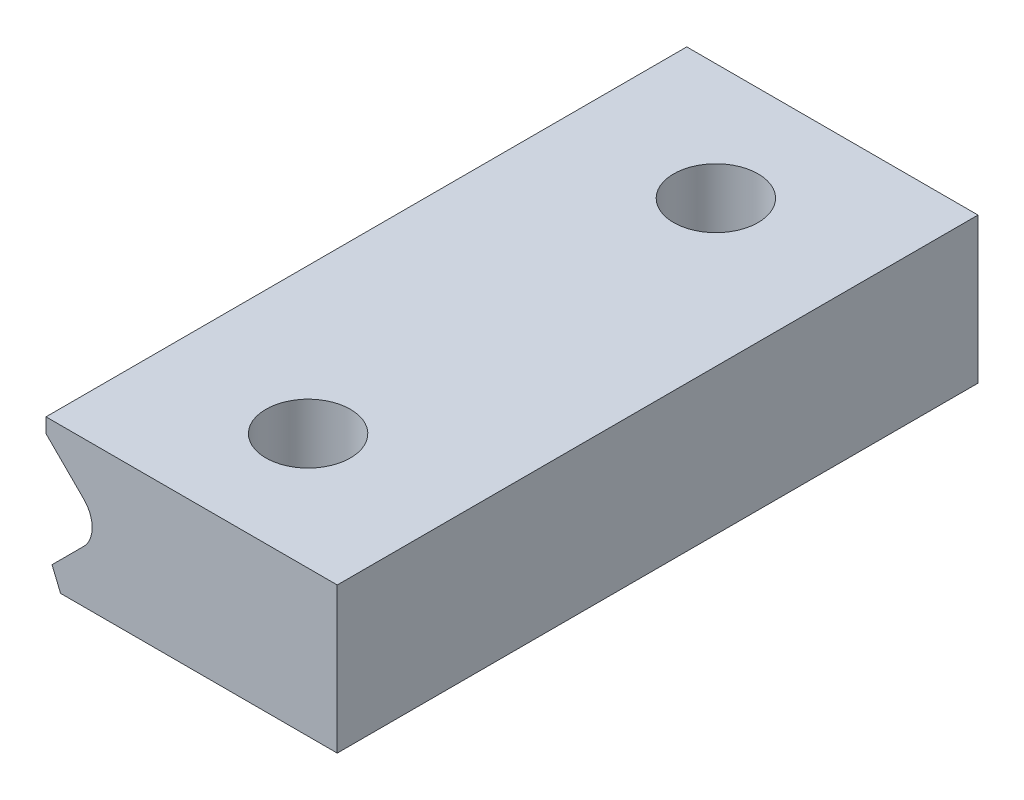
ISO-10303-21;
HEADER;
FILE_DESCRIPTION(('STEP AP214'),'2;1');
FILE_NAME('part.step','',(''),(''),'','','');
FILE_SCHEMA(('AUTOMOTIVE_DESIGN { 1 0 10303 214 1 1 1 1 }'));
ENDSEC;
DATA;
#1=APPLICATION_CONTEXT('core data for automotive mechanical design processes');
#2=APPLICATION_PROTOCOL_DEFINITION('international standard','automotive_design',2000,#1);
#3=PRODUCT_CONTEXT('',#1,'mechanical');
#4=PRODUCT('Part','Part','',(#3));
#5=PRODUCT_RELATED_PRODUCT_CATEGORY('part','',(#4));
#6=PRODUCT_DEFINITION_FORMATION('','',#4);
#7=PRODUCT_DEFINITION_CONTEXT('part definition',#1,'design');
#8=PRODUCT_DEFINITION('design','',#6,#7);
#9=PRODUCT_DEFINITION_SHAPE('','',#8);
#10=(LENGTH_UNIT() NAMED_UNIT(*) SI_UNIT(.MILLI.,.METRE.));
#11=(NAMED_UNIT(*) PLANE_ANGLE_UNIT() SI_UNIT($,.RADIAN.));
#12=(NAMED_UNIT(*) SI_UNIT($,.STERADIAN.) SOLID_ANGLE_UNIT());
#13=UNCERTAINTY_MEASURE_WITH_UNIT(LENGTH_MEASURE(1.E-05),#10,'distance_accuracy_value','');
#14=(GEOMETRIC_REPRESENTATION_CONTEXT(3) GLOBAL_UNCERTAINTY_ASSIGNED_CONTEXT((#13)) GLOBAL_UNIT_ASSIGNED_CONTEXT((#10,
#11,#12)) REPRESENTATION_CONTEXT('',''));
#15=CARTESIAN_POINT('',(0.,0.,0.));
#16=DIRECTION('',(0.,0.,1.));
#17=DIRECTION('',(1.,0.,0.));
#18=AXIS2_PLACEMENT_3D('',#15,#16,#17);
#19=CARTESIAN_POINT('',(-10.5,2.5,11.));
#20=DIRECTION('',(0.,-1.,0.));
#21=DIRECTION('',(1.,0.,0.));
#22=AXIS2_PLACEMENT_3D('',#19,#20,#21);
#23=PLANE('',#22);
#24=CARTESIAN_POINT('',(-5.,2.5,7.));
#25=DIRECTION('',(0.,-1.,0.));
#26=DIRECTION('',(0.,0.,-1.));
#27=AXIS2_PLACEMENT_3D('',#24,#25,#26);
#28=CIRCLE('',#27,1.45);
#29=CARTESIAN_POINT('',(-5.,2.5,5.55));
#30=VERTEX_POINT('',#29);
#31=EDGE_CURVE('E207',#30,#30,#28,.T.);
#32=ORIENTED_EDGE('',*,*,#31,.T.);
#33=EDGE_LOOP('',(#32));
#34=FACE_BOUND('',#33,.T.);
#35=CARTESIAN_POINT('',(-5.,2.5,-7.));
#36=DIRECTION('',(0.,-1.,0.));
#37=DIRECTION('',(0.,0.,-1.));
#38=AXIS2_PLACEMENT_3D('',#35,#36,#37);
#39=CIRCLE('',#38,1.45);
#40=CARTESIAN_POINT('',(-5.,2.5,-8.45));
#41=VERTEX_POINT('',#40);
#42=EDGE_CURVE('E194',#41,#41,#39,.T.);
#43=ORIENTED_EDGE('',*,*,#42,.T.);
#44=EDGE_LOOP('',(#43));
#45=FACE_BOUND('',#44,.T.);
#46=DIRECTION('',(-1.,0.,0.));
#47=VECTOR('',#46,1.);
#48=CARTESIAN_POINT('',(-10.5,2.5,-11.));
#49=LINE('',#48,#47);
#50=CARTESIAN_POINT('',(0.,2.5,-11.));
#51=VERTEX_POINT('',#50);
#52=CARTESIAN_POINT('',(-10.,2.5,-11.));
#53=VERTEX_POINT('',#52);
#54=EDGE_CURVE('E133',#51,#53,#49,.T.);
#55=ORIENTED_EDGE('',*,*,#54,.T.);
#56=DIRECTION('',(0.,0.,1.));
#57=VECTOR('',#56,1.);
#58=CARTESIAN_POINT('',(-10.,2.5,-11.));
#59=LINE('',#58,#57);
#60=CARTESIAN_POINT('',(-10.,2.5,11.));
#61=VERTEX_POINT('',#60);
#62=EDGE_CURVE('E59',#53,#61,#59,.T.);
#63=ORIENTED_EDGE('',*,*,#62,.T.);
#64=DIRECTION('',(-1.,0.,0.));
#65=VECTOR('',#64,1.);
#66=CARTESIAN_POINT('',(-10.5,2.5,11.));
#67=LINE('',#66,#65);
#68=CARTESIAN_POINT('',(0.,2.5,11.));
#69=VERTEX_POINT('',#68);
#70=EDGE_CURVE('E147',#69,#61,#67,.T.);
#71=ORIENTED_EDGE('',*,*,#70,.F.);
#72=DIRECTION('',(0.,0.,-1.));
#73=VECTOR('',#72,1.);
#74=CARTESIAN_POINT('',(0.,2.5,11.));
#75=LINE('',#74,#73);
#76=EDGE_CURVE('E148',#69,#51,#75,.T.);
#77=ORIENTED_EDGE('',*,*,#76,.T.);
#78=EDGE_LOOP('',(#55,#63,#71,#77));
#79=FACE_BOUND('',#78,.T.);
#80=ADVANCED_FACE('F42',(#34,#45,#79),#23,.F.);
#81=CARTESIAN_POINT('',(-10.5,2.5,11.));
#82=DIRECTION('',(0.707106781186549,0.707106781186546,0.));
#83=DIRECTION('',(-0.707106781186546,0.707106781186549,0.));
#84=AXIS2_PLACEMENT_3D('',#81,#82,#83);
#85=PLANE('',#84);
#86=DIRECTION('',(0.707106781186546,-0.707106781186549,0.));
#87=VECTOR('',#86,1.);
#88=CARTESIAN_POINT('',(-10.5,2.5,11.));
#89=LINE('',#88,#87);
#90=CARTESIAN_POINT('',(-10.,2.,11.));
#91=VERTEX_POINT('',#90);
#92=CARTESIAN_POINT('',(-8.70710678118655,0.707106781186547,11.));
#93=VERTEX_POINT('',#92);
#94=EDGE_CURVE('E124',#91,#93,#89,.T.);
#95=ORIENTED_EDGE('',*,*,#94,.F.);
#96=DIRECTION('',(0.,0.,1.));
#97=VECTOR('',#96,1.);
#98=CARTESIAN_POINT('',(-10.,2.,-11.));
#99=LINE('',#98,#97);
#100=CARTESIAN_POINT('',(-10.,2.,-11.));
#101=VERTEX_POINT('',#100);
#102=EDGE_CURVE('E109',#101,#91,#99,.T.);
#103=ORIENTED_EDGE('',*,*,#102,.F.);
#104=DIRECTION('',(0.707106781186546,-0.707106781186549,0.));
#105=VECTOR('',#104,1.);
#106=CARTESIAN_POINT('',(-10.5,2.5,-11.));
#107=LINE('',#106,#105);
#108=CARTESIAN_POINT('',(-8.70710678118655,0.707106781186547,-11.));
#109=VERTEX_POINT('',#108);
#110=EDGE_CURVE('E122',#101,#109,#107,.T.);
#111=ORIENTED_EDGE('',*,*,#110,.T.);
#112=DIRECTION('',(0.,0.,-1.));
#113=VECTOR('',#112,1.);
#114=CARTESIAN_POINT('',(-8.70710678118655,0.707106781186547,11.));
#115=LINE('',#114,#113);
#116=EDGE_CURVE('E161',#109,#93,#115,.F.);
#117=ORIENTED_EDGE('',*,*,#116,.T.);
#118=EDGE_LOOP('',(#95,#103,#111,#117));
#119=FACE_BOUND('',#118,.T.);
#120=ADVANCED_FACE('F120',(#119),#85,.F.);
#121=CARTESIAN_POINT('',(-10.5,-2.5,11.));
#122=DIRECTION('',(0.707106781186548,-0.707106781186547,0.));
#123=DIRECTION('',(0.707106781186547,0.707106781186548,0.));
#124=AXIS2_PLACEMENT_3D('',#121,#122,#123);
#125=PLANE('',#124);
#126=DIRECTION('',(-0.707106781186547,-0.707106781186548,0.));
#127=VECTOR('',#126,1.);
#128=CARTESIAN_POINT('',(-10.5,-2.5,-11.));
#129=LINE('',#128,#127);
#130=CARTESIAN_POINT('',(-8.70710678118655,-0.707106781186546,-11.));
#131=VERTEX_POINT('',#130);
#132=CARTESIAN_POINT('',(-9.79289321881345,-1.79289321881345,-11.));
#133=VERTEX_POINT('',#132);
#134=EDGE_CURVE('E132',#131,#133,#129,.T.);
#135=ORIENTED_EDGE('',*,*,#134,.T.);
#136=DIRECTION('',(0.,0.,1.));
#137=VECTOR('',#136,1.);
#138=CARTESIAN_POINT('',(-9.79289321881345,-1.79289321881345,11.));
#139=LINE('',#138,#137);
#140=CARTESIAN_POINT('',(-9.79289321881345,-1.79289321881345,11.));
#141=VERTEX_POINT('',#140);
#142=EDGE_CURVE('E52',#133,#141,#139,.T.);
#143=ORIENTED_EDGE('',*,*,#142,.T.);
#144=DIRECTION('',(-0.707106781186547,-0.707106781186548,0.));
#145=VECTOR('',#144,1.);
#146=CARTESIAN_POINT('',(-10.5,-2.5,11.));
#147=LINE('',#146,#145);
#148=CARTESIAN_POINT('',(-8.70710678118655,-0.707106781186546,11.));
#149=VERTEX_POINT('',#148);
#150=EDGE_CURVE('E180',#149,#141,#147,.T.);
#151=ORIENTED_EDGE('',*,*,#150,.F.);
#152=DIRECTION('',(0.,0.,-1.));
#153=VECTOR('',#152,1.);
#154=CARTESIAN_POINT('',(-8.70710678118655,-0.707106781186546,-11.));
#155=LINE('',#154,#153);
#156=EDGE_CURVE('E157',#149,#131,#155,.T.);
#157=ORIENTED_EDGE('',*,*,#156,.T.);
#158=EDGE_LOOP('',(#135,#143,#151,#157));
#159=FACE_BOUND('',#158,.T.);
#160=ADVANCED_FACE('F226',(#159),#125,.F.);
#161=CARTESIAN_POINT('',(-10.5,-2.5,11.));
#162=DIRECTION('',(0.,1.,0.));
#163=DIRECTION('',(-1.,0.,0.));
#164=AXIS2_PLACEMENT_3D('',#161,#162,#163);
#165=PLANE('',#164);
#166=CARTESIAN_POINT('',(-5.,-2.5,7.));
#167=DIRECTION('',(0.,-1.,0.));
#168=DIRECTION('',(0.,0.,-1.));
#169=AXIS2_PLACEMENT_3D('',#166,#167,#168);
#170=CIRCLE('',#169,2.7);
#171=CARTESIAN_POINT('',(-5.,-2.5,4.3));
#172=VERTEX_POINT('',#171);
#173=EDGE_CURVE('E215',#172,#172,#170,.T.);
#174=ORIENTED_EDGE('',*,*,#173,.F.);
#175=EDGE_LOOP('',(#174));
#176=FACE_BOUND('',#175,.T.);
#177=CARTESIAN_POINT('',(-5.,-2.5,-7.));
#178=DIRECTION('',(0.,-1.,0.));
#179=DIRECTION('',(0.,0.,-1.));
#180=AXIS2_PLACEMENT_3D('',#177,#178,#179);
#181=CIRCLE('',#180,2.7);
#182=CARTESIAN_POINT('',(-5.,-2.5,-9.7));
#183=VERTEX_POINT('',#182);
#184=EDGE_CURVE('E203',#183,#183,#181,.T.);
#185=ORIENTED_EDGE('',*,*,#184,.F.);
#186=EDGE_LOOP('',(#185));
#187=FACE_BOUND('',#186,.T.);
#188=DIRECTION('',(1.,0.,0.));
#189=VECTOR('',#188,1.);
#190=CARTESIAN_POINT('',(-10.5,-2.5,11.));
#191=LINE('',#190,#189);
#192=CARTESIAN_POINT('',(-9.5,-2.5,11.));
#193=VERTEX_POINT('',#192);
#194=CARTESIAN_POINT('',(0.,-2.5,11.));
#195=VERTEX_POINT('',#194);
#196=EDGE_CURVE('E178',#193,#195,#191,.T.);
#197=ORIENTED_EDGE('',*,*,#196,.F.);
#198=DIRECTION('',(0.,0.,-1.));
#199=VECTOR('',#198,1.);
#200=CARTESIAN_POINT('',(-9.5,-2.5,11.));
#201=LINE('',#200,#199);
#202=CARTESIAN_POINT('',(-9.5,-2.5,-11.));
#203=VERTEX_POINT('',#202);
#204=EDGE_CURVE('E169',#193,#203,#201,.T.);
#205=ORIENTED_EDGE('',*,*,#204,.T.);
#206=DIRECTION('',(1.,0.,0.));
#207=VECTOR('',#206,1.);
#208=CARTESIAN_POINT('',(-10.5,-2.5,-11.));
#209=LINE('',#208,#207);
#210=CARTESIAN_POINT('',(0.,-2.5,-11.));
#211=VERTEX_POINT('',#210);
#212=EDGE_CURVE('E137',#203,#211,#209,.T.);
#213=ORIENTED_EDGE('',*,*,#212,.T.);
#214=DIRECTION('',(0.,0.,-1.));
#215=VECTOR('',#214,1.);
#216=CARTESIAN_POINT('',(0.,-2.5,11.));
#217=LINE('',#216,#215);
#218=EDGE_CURVE('E152',#195,#211,#217,.T.);
#219=ORIENTED_EDGE('',*,*,#218,.F.);
#220=EDGE_LOOP('',(#197,#205,#213,#219));
#221=FACE_BOUND('',#220,.T.);
#222=ADVANCED_FACE('F222',(#176,#187,#221),#165,.F.);
#223=CARTESIAN_POINT('',(0.,2.5,11.));
#224=DIRECTION('',(-1.,0.,0.));
#225=DIRECTION('',(0.,0.,1.));
#226=AXIS2_PLACEMENT_3D('',#223,#224,#225);
#227=PLANE('',#226);
#228=DIRECTION('',(0.,1.,0.));
#229=VECTOR('',#228,1.);
#230=CARTESIAN_POINT('',(0.,2.5,-11.));
#231=LINE('',#230,#229);
#232=EDGE_CURVE('E144',#211,#51,#231,.T.);
#233=ORIENTED_EDGE('',*,*,#232,.T.);
#234=ORIENTED_EDGE('',*,*,#76,.F.);
#235=DIRECTION('',(0.,1.,0.));
#236=VECTOR('',#235,1.);
#237=CARTESIAN_POINT('',(0.,2.5,11.));
#238=LINE('',#237,#236);
#239=EDGE_CURVE('E153',#195,#69,#238,.T.);
#240=ORIENTED_EDGE('',*,*,#239,.F.);
#241=ORIENTED_EDGE('',*,*,#218,.T.);
#242=EDGE_LOOP('',(#233,#234,#240,#241));
#243=FACE_BOUND('',#242,.T.);
#244=ADVANCED_FACE('F225',(#243),#227,.F.);
#245=CARTESIAN_POINT('',(0.,0.,11.));
#246=DIRECTION('',(0.,0.,-1.));
#247=DIRECTION('',(-1.,0.,0.));
#248=AXIS2_PLACEMENT_3D('',#245,#246,#247);
#249=PLANE('',#248);
#250=ORIENTED_EDGE('',*,*,#70,.T.);
#251=DIRECTION('',(0.,1.,0.));
#252=VECTOR('',#251,1.);
#253=CARTESIAN_POINT('',(-9.99999999999999,0.,11.));
#254=LINE('',#253,#252);
#255=EDGE_CURVE('E116',#91,#61,#254,.T.);
#256=ORIENTED_EDGE('',*,*,#255,.F.);
#257=ORIENTED_EDGE('',*,*,#94,.T.);
#258=CARTESIAN_POINT('',(-9.4142135623731,0.,11.));
#259=DIRECTION('',(0.,0.,-1.));
#260=DIRECTION('',(-1.,0.,0.));
#261=AXIS2_PLACEMENT_3D('',#258,#259,#260);
#262=CIRCLE('',#261,1.);
#263=EDGE_CURVE('E166',#93,#149,#262,.T.);
#264=ORIENTED_EDGE('',*,*,#263,.T.);
#265=ORIENTED_EDGE('',*,*,#150,.T.);
#266=DIRECTION('',(-0.38268343236509,0.923879532511287,0.));
#267=VECTOR('',#266,1.);
#268=CARTESIAN_POINT('',(-9.5,-2.5,11.));
#269=LINE('',#268,#267);
#270=EDGE_CURVE('E11',#141,#193,#269,.F.);
#271=ORIENTED_EDGE('',*,*,#270,.T.);
#272=ORIENTED_EDGE('',*,*,#196,.T.);
#273=ORIENTED_EDGE('',*,*,#239,.T.);
#274=EDGE_LOOP('',(#250,#256,#257,#264,#265,#271,#272,#273));
#275=FACE_BOUND('',#274,.T.);
#276=ADVANCED_FACE('F242',(#275),#249,.F.);
#277=CARTESIAN_POINT('',(0.,0.,-11.));
#278=DIRECTION('',(0.,0.,-1.));
#279=DIRECTION('',(-1.,0.,0.));
#280=AXIS2_PLACEMENT_3D('',#277,#278,#279);
#281=PLANE('',#280);
#282=DIRECTION('',(0.,1.,0.));
#283=VECTOR('',#282,1.);
#284=CARTESIAN_POINT('',(-9.99999999999999,0.,-11.));
#285=LINE('',#284,#283);
#286=EDGE_CURVE('E106',#101,#53,#285,.T.);
#287=ORIENTED_EDGE('',*,*,#286,.T.);
#288=ORIENTED_EDGE('',*,*,#54,.F.);
#289=ORIENTED_EDGE('',*,*,#232,.F.);
#290=ORIENTED_EDGE('',*,*,#212,.F.);
#291=DIRECTION('',(0.38268343236509,-0.923879532511287,0.));
#292=VECTOR('',#291,1.);
#293=CARTESIAN_POINT('',(-8.99264068711929,-3.72487373415291,-11.));
#294=LINE('',#293,#292);
#295=EDGE_CURVE('E173',#203,#133,#294,.F.);
#296=ORIENTED_EDGE('',*,*,#295,.T.);
#297=ORIENTED_EDGE('',*,*,#134,.F.);
#298=CARTESIAN_POINT('',(-9.4142135623731,0.,-11.));
#299=DIRECTION('',(0.,0.,-1.));
#300=DIRECTION('',(-1.,0.,0.));
#301=AXIS2_PLACEMENT_3D('',#298,#299,#300);
#302=CIRCLE('',#301,1.);
#303=EDGE_CURVE('E129',#131,#109,#302,.F.);
#304=ORIENTED_EDGE('',*,*,#303,.T.);
#305=ORIENTED_EDGE('',*,*,#110,.F.);
#306=EDGE_LOOP('',(#287,#288,#289,#290,#296,#297,#304,#305));
#307=FACE_BOUND('',#306,.T.);
#308=ADVANCED_FACE('F127',(#307),#281,.T.);
#309=CARTESIAN_POINT('',(-9.4142135623731,0.,11.));
#310=DIRECTION('',(0.,0.,1.));
#311=DIRECTION('',(1.,0.,0.));
#312=AXIS2_PLACEMENT_3D('',#309,#310,#311);
#313=CYLINDRICAL_SURFACE('',#312,1.);
#314=ORIENTED_EDGE('',*,*,#263,.F.);
#315=ORIENTED_EDGE('',*,*,#116,.F.);
#316=ORIENTED_EDGE('',*,*,#303,.F.);
#317=ORIENTED_EDGE('',*,*,#156,.F.);
#318=EDGE_LOOP('',(#314,#315,#316,#317));
#319=FACE_BOUND('',#318,.T.);
#320=ADVANCED_FACE('F241',(#319),#313,.F.);
#321=CARTESIAN_POINT('',(-9.5,-2.5,11.));
#322=DIRECTION('',(0.923879532511287,0.382683432365089,0.));
#323=DIRECTION('',(0.,0.,-1.));
#324=AXIS2_PLACEMENT_3D('',#321,#322,#323);
#325=PLANE('',#324);
#326=ORIENTED_EDGE('',*,*,#270,.F.);
#327=ORIENTED_EDGE('',*,*,#142,.F.);
#328=ORIENTED_EDGE('',*,*,#295,.F.);
#329=ORIENTED_EDGE('',*,*,#204,.F.);
#330=EDGE_LOOP('',(#326,#327,#328,#329));
#331=FACE_BOUND('',#330,.T.);
#332=ADVANCED_FACE('F45',(#331),#325,.F.);
#333=CARTESIAN_POINT('',(-9.99999999999999,0.,-11.));
#334=DIRECTION('',(1.,0.,0.));
#335=DIRECTION('',(0.,1.,0.));
#336=AXIS2_PLACEMENT_3D('',#333,#334,#335);
#337=PLANE('',#336);
#338=ORIENTED_EDGE('',*,*,#255,.T.);
#339=ORIENTED_EDGE('',*,*,#62,.F.);
#340=ORIENTED_EDGE('',*,*,#286,.F.);
#341=ORIENTED_EDGE('',*,*,#102,.T.);
#342=EDGE_LOOP('',(#338,#339,#340,#341));
#343=FACE_BOUND('',#342,.T.);
#344=ADVANCED_FACE('F108',(#343),#337,.F.);
#345=CARTESIAN_POINT('',(-5.,-2.5,-7.));
#346=DIRECTION('',(0.,-1.,0.));
#347=DIRECTION('',(0.,0.,-1.));
#348=AXIS2_PLACEMENT_3D('',#345,#346,#347);
#349=CYLINDRICAL_SURFACE('',#348,1.45);
#350=ORIENTED_EDGE('',*,*,#42,.F.);
#351=EDGE_LOOP('',(#350));
#352=FACE_BOUND('',#351,.T.);
#353=CARTESIAN_POINT('',(-5.,-1.25,-7.));
#354=DIRECTION('',(0.,-1.,0.));
#355=DIRECTION('',(0.,0.,-1.));
#356=AXIS2_PLACEMENT_3D('',#353,#354,#355);
#357=CIRCLE('',#356,1.45);
#358=CARTESIAN_POINT('',(-5.,-1.25,-8.45));
#359=VERTEX_POINT('',#358);
#360=EDGE_CURVE('E199',#359,#359,#357,.T.);
#361=ORIENTED_EDGE('',*,*,#360,.T.);
#362=EDGE_LOOP('',(#361));
#363=FACE_BOUND('',#362,.T.);
#364=ADVANCED_FACE('F272',(#352,#363),#349,.F.);
#365=CARTESIAN_POINT('',(-5.,-2.5,-7.));
#366=DIRECTION('',(0.,-1.,0.));
#367=DIRECTION('',(0.,0.,-1.));
#368=AXIS2_PLACEMENT_3D('',#365,#366,#367);
#369=CONICAL_SURFACE('',#368,2.7,0.785398163397449);
#370=ORIENTED_EDGE('',*,*,#360,.F.);
#371=EDGE_LOOP('',(#370));
#372=FACE_BOUND('',#371,.T.);
#373=ORIENTED_EDGE('',*,*,#184,.T.);
#374=EDGE_LOOP('',(#373));
#375=FACE_BOUND('',#374,.T.);
#376=ADVANCED_FACE('F275',(#372,#375),#369,.F.);
#377=CARTESIAN_POINT('',(-5.,-2.5,7.));
#378=DIRECTION('',(0.,-1.,0.));
#379=DIRECTION('',(0.,0.,-1.));
#380=AXIS2_PLACEMENT_3D('',#377,#378,#379);
#381=CYLINDRICAL_SURFACE('',#380,1.45);
#382=ORIENTED_EDGE('',*,*,#31,.F.);
#383=EDGE_LOOP('',(#382));
#384=FACE_BOUND('',#383,.T.);
#385=CARTESIAN_POINT('',(-5.,-1.25,7.));
#386=DIRECTION('',(0.,-1.,0.));
#387=DIRECTION('',(0.,0.,-1.));
#388=AXIS2_PLACEMENT_3D('',#385,#386,#387);
#389=CIRCLE('',#388,1.45);
#390=CARTESIAN_POINT('',(-5.,-1.25,5.55));
#391=VERTEX_POINT('',#390);
#392=EDGE_CURVE('E211',#391,#391,#389,.T.);
#393=ORIENTED_EDGE('',*,*,#392,.T.);
#394=EDGE_LOOP('',(#393));
#395=FACE_BOUND('',#394,.T.);
#396=ADVANCED_FACE('F279',(#384,#395),#381,.F.);
#397=CARTESIAN_POINT('',(-5.,-2.5,7.));
#398=DIRECTION('',(0.,-1.,0.));
#399=DIRECTION('',(0.,0.,-1.));
#400=AXIS2_PLACEMENT_3D('',#397,#398,#399);
#401=CONICAL_SURFACE('',#400,2.7,0.785398163397449);
#402=ORIENTED_EDGE('',*,*,#392,.F.);
#403=EDGE_LOOP('',(#402));
#404=FACE_BOUND('',#403,.T.);
#405=ORIENTED_EDGE('',*,*,#173,.T.);
#406=EDGE_LOOP('',(#405));
#407=FACE_BOUND('',#406,.T.);
#408=ADVANCED_FACE('F220',(#404,#407),#401,.F.);
#409=CLOSED_SHELL('',(#80,#120,#160,#222,#244,#276,#308,#320,#332,#344,#364,#376,#396,#408));
#410=MANIFOLD_SOLID_BREP('B2',#409);
#411=ADVANCED_BREP_SHAPE_REPRESENTATION('',(#18,#410),#14);
#412=SHAPE_DEFINITION_REPRESENTATION(#9,#411);
ENDSEC;
END-ISO-10303-21;
